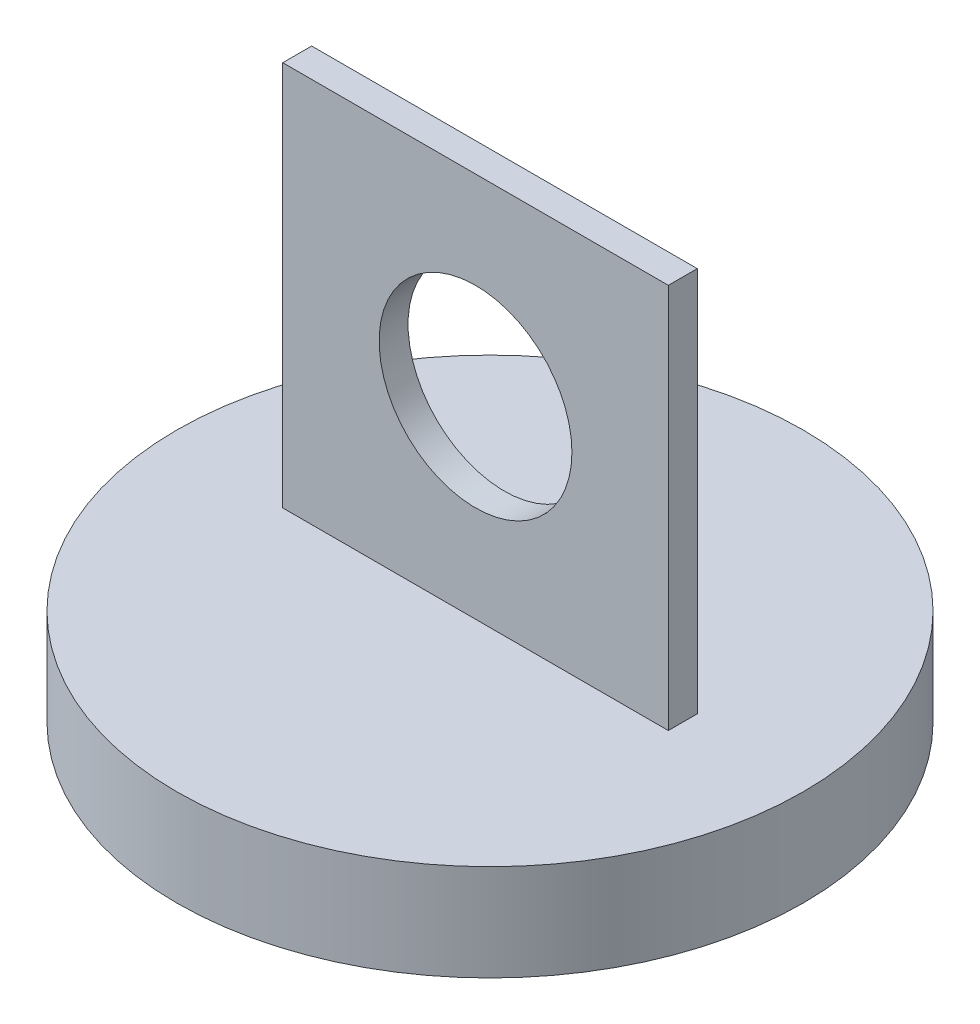
ISO-10303-21;
HEADER;
FILE_DESCRIPTION(('STEP AP214'),'2;1');
FILE_NAME('part.step','',(''),(''),'','','');
FILE_SCHEMA(('AUTOMOTIVE_DESIGN { 1 0 10303 214 1 1 1 1 }'));
ENDSEC;
DATA;
#1=APPLICATION_CONTEXT('core data for automotive mechanical design processes');
#2=APPLICATION_PROTOCOL_DEFINITION('international standard','automotive_design',2000,#1);
#3=PRODUCT_CONTEXT('',#1,'mechanical');
#4=PRODUCT('Part','Part','',(#3));
#5=PRODUCT_RELATED_PRODUCT_CATEGORY('part','',(#4));
#6=PRODUCT_DEFINITION_FORMATION('','',#4);
#7=PRODUCT_DEFINITION_CONTEXT('part definition',#1,'design');
#8=PRODUCT_DEFINITION('design','',#6,#7);
#9=PRODUCT_DEFINITION_SHAPE('','',#8);
#10=(LENGTH_UNIT() NAMED_UNIT(*) SI_UNIT(.MILLI.,.METRE.));
#11=(NAMED_UNIT(*) PLANE_ANGLE_UNIT() SI_UNIT($,.RADIAN.));
#12=(NAMED_UNIT(*) SI_UNIT($,.STERADIAN.) SOLID_ANGLE_UNIT());
#13=UNCERTAINTY_MEASURE_WITH_UNIT(LENGTH_MEASURE(1.E-05),#10,'distance_accuracy_value','');
#14=(GEOMETRIC_REPRESENTATION_CONTEXT(3) GLOBAL_UNCERTAINTY_ASSIGNED_CONTEXT((#13)) GLOBAL_UNIT_ASSIGNED_CONTEXT((#10,
#11,#12)) REPRESENTATION_CONTEXT('',''));
#15=CARTESIAN_POINT('',(0.,0.,0.));
#16=DIRECTION('',(0.,0.,1.));
#17=DIRECTION('',(1.,0.,0.));
#18=AXIS2_PLACEMENT_3D('',#15,#16,#17);
#19=CARTESIAN_POINT('',(0.,10.,0.));
#20=DIRECTION('',(0.,1.,0.));
#21=DIRECTION('',(0.,0.,1.));
#22=AXIS2_PLACEMENT_3D('',#19,#20,#21);
#23=PLANE('',#22);
#24=CARTESIAN_POINT('',(0.,10.,0.));
#25=DIRECTION('',(0.,1.,0.));
#26=DIRECTION('',(0.,0.,1.));
#27=AXIS2_PLACEMENT_3D('',#24,#25,#26);
#28=CIRCLE('',#27,32.5);
#29=CARTESIAN_POINT('',(0.,10.,32.5));
#30=VERTEX_POINT('',#29);
#31=EDGE_CURVE('E11',#30,#30,#28,.T.);
#32=ORIENTED_EDGE('',*,*,#31,.T.);
#33=EDGE_LOOP('',(#32));
#34=FACE_BOUND('',#33,.T.);
#35=DIRECTION('',(1.,0.,0.));
#36=VECTOR('',#35,1.);
#37=CARTESIAN_POINT('',(20.,10.,1.5));
#38=LINE('',#37,#36);
#39=CARTESIAN_POINT('',(-20.,10.,1.5));
#40=VERTEX_POINT('',#39);
#41=CARTESIAN_POINT('',(20.,10.,1.5));
#42=VERTEX_POINT('',#41);
#43=EDGE_CURVE('E94',#40,#42,#38,.T.);
#44=ORIENTED_EDGE('',*,*,#43,.F.);
#45=DIRECTION('',(0.,0.,1.));
#46=VECTOR('',#45,1.);
#47=CARTESIAN_POINT('',(-20.,10.,-1.5));
#48=LINE('',#47,#46);
#49=CARTESIAN_POINT('',(-20.,10.,-1.5));
#50=VERTEX_POINT('',#49);
#51=EDGE_CURVE('E105',#50,#40,#48,.T.);
#52=ORIENTED_EDGE('',*,*,#51,.F.);
#53=DIRECTION('',(-1.,0.,0.));
#54=VECTOR('',#53,1.);
#55=CARTESIAN_POINT('',(20.,10.,-1.5));
#56=LINE('',#55,#54);
#57=CARTESIAN_POINT('',(20.,10.,-1.5));
#58=VERTEX_POINT('',#57);
#59=EDGE_CURVE('E75',#58,#50,#56,.T.);
#60=ORIENTED_EDGE('',*,*,#59,.F.);
#61=DIRECTION('',(0.,0.,-1.));
#62=VECTOR('',#61,1.);
#63=CARTESIAN_POINT('',(20.,10.,-1.5));
#64=LINE('',#63,#62);
#65=EDGE_CURVE('E109',#42,#58,#64,.T.);
#66=ORIENTED_EDGE('',*,*,#65,.F.);
#67=EDGE_LOOP('',(#44,#52,#60,#66));
#68=FACE_BOUND('',#67,.T.);
#69=ADVANCED_FACE('F36',(#34,#68),#23,.T.);
#70=CARTESIAN_POINT('',(0.,10.,0.));
#71=DIRECTION('',(0.,-1.,0.));
#72=DIRECTION('',(0.,0.,-1.));
#73=AXIS2_PLACEMENT_3D('',#70,#71,#72);
#74=CYLINDRICAL_SURFACE('',#73,32.5);
#75=ORIENTED_EDGE('',*,*,#31,.F.);
#76=EDGE_LOOP('',(#75));
#77=FACE_BOUND('',#76,.T.);
#78=CARTESIAN_POINT('',(0.,0.,0.));
#79=DIRECTION('',(0.,1.,0.));
#80=DIRECTION('',(0.,0.,1.));
#81=AXIS2_PLACEMENT_3D('',#78,#79,#80);
#82=CIRCLE('',#81,32.5);
#83=CARTESIAN_POINT('',(0.,0.,32.5));
#84=VERTEX_POINT('',#83);
#85=EDGE_CURVE('E45',#84,#84,#82,.T.);
#86=ORIENTED_EDGE('',*,*,#85,.T.);
#87=EDGE_LOOP('',(#86));
#88=FACE_BOUND('',#87,.T.);
#89=ADVANCED_FACE('F38',(#77,#88),#74,.T.);
#90=CARTESIAN_POINT('',(0.,0.,0.));
#91=DIRECTION('',(0.,1.,0.));
#92=DIRECTION('',(0.,0.,1.));
#93=AXIS2_PLACEMENT_3D('',#90,#91,#92);
#94=PLANE('',#93);
#95=ORIENTED_EDGE('',*,*,#85,.F.);
#96=EDGE_LOOP('',(#95));
#97=FACE_BOUND('',#96,.T.);
#98=ADVANCED_FACE('F118',(#97),#94,.F.);
#99=CARTESIAN_POINT('',(-20.,50.,-1.5));
#100=DIRECTION('',(1.,0.,0.));
#101=DIRECTION('',(0.,0.,-1.));
#102=AXIS2_PLACEMENT_3D('',#99,#100,#101);
#103=PLANE('',#102);
#104=ORIENTED_EDGE('',*,*,#51,.T.);
#105=DIRECTION('',(0.,-1.,0.));
#106=VECTOR('',#105,1.);
#107=CARTESIAN_POINT('',(-20.,50.,1.5));
#108=LINE('',#107,#106);
#109=CARTESIAN_POINT('',(-20.,50.,1.5));
#110=VERTEX_POINT('',#109);
#111=EDGE_CURVE('E97',#110,#40,#108,.T.);
#112=ORIENTED_EDGE('',*,*,#111,.F.);
#113=DIRECTION('',(0.,0.,1.));
#114=VECTOR('',#113,1.);
#115=CARTESIAN_POINT('',(-20.,50.,-1.5));
#116=LINE('',#115,#114);
#117=CARTESIAN_POINT('',(-20.,50.,-1.5));
#118=VERTEX_POINT('',#117);
#119=EDGE_CURVE('E87',#118,#110,#116,.T.);
#120=ORIENTED_EDGE('',*,*,#119,.F.);
#121=DIRECTION('',(0.,-1.,0.));
#122=VECTOR('',#121,1.);
#123=CARTESIAN_POINT('',(-20.,50.,-1.5));
#124=LINE('',#123,#122);
#125=EDGE_CURVE('E101',#118,#50,#124,.T.);
#126=ORIENTED_EDGE('',*,*,#125,.T.);
#127=EDGE_LOOP('',(#104,#112,#120,#126));
#128=FACE_BOUND('',#127,.T.);
#129=ADVANCED_FACE('F120',(#128),#103,.F.);
#130=CARTESIAN_POINT('',(20.,50.,1.5));
#131=DIRECTION('',(0.,0.,-1.));
#132=DIRECTION('',(-1.,0.,0.));
#133=AXIS2_PLACEMENT_3D('',#130,#131,#132);
#134=PLANE('',#133);
#135=CARTESIAN_POINT('',(0.,30.,1.5));
#136=DIRECTION('',(0.,0.,1.));
#137=DIRECTION('',(1.,0.,0.));
#138=AXIS2_PLACEMENT_3D('',#135,#136,#137);
#139=CIRCLE('',#138,10.);
#140=CARTESIAN_POINT('',(10.,30.,1.5));
#141=VERTEX_POINT('',#140);
#142=EDGE_CURVE('E154',#141,#141,#139,.T.);
#143=ORIENTED_EDGE('',*,*,#142,.F.);
#144=EDGE_LOOP('',(#143));
#145=FACE_BOUND('',#144,.T.);
#146=ORIENTED_EDGE('',*,*,#43,.T.);
#147=DIRECTION('',(0.,-1.,0.));
#148=VECTOR('',#147,1.);
#149=CARTESIAN_POINT('',(20.,50.,1.5));
#150=LINE('',#149,#148);
#151=CARTESIAN_POINT('',(20.,50.,1.5));
#152=VERTEX_POINT('',#151);
#153=EDGE_CURVE('E91',#152,#42,#150,.T.);
#154=ORIENTED_EDGE('',*,*,#153,.F.);
#155=DIRECTION('',(1.,0.,0.));
#156=VECTOR('',#155,1.);
#157=CARTESIAN_POINT('',(20.,50.,1.5));
#158=LINE('',#157,#156);
#159=EDGE_CURVE('E82',#110,#152,#158,.T.);
#160=ORIENTED_EDGE('',*,*,#159,.F.);
#161=ORIENTED_EDGE('',*,*,#111,.T.);
#162=EDGE_LOOP('',(#146,#154,#160,#161));
#163=FACE_BOUND('',#162,.T.);
#164=ADVANCED_FACE('F92',(#145,#163),#134,.F.);
#165=CARTESIAN_POINT('',(20.,50.,-1.5));
#166=DIRECTION('',(-1.,0.,0.));
#167=DIRECTION('',(0.,0.,1.));
#168=AXIS2_PLACEMENT_3D('',#165,#166,#167);
#169=PLANE('',#168);
#170=ORIENTED_EDGE('',*,*,#65,.T.);
#171=DIRECTION('',(0.,-1.,0.));
#172=VECTOR('',#171,1.);
#173=CARTESIAN_POINT('',(20.,50.,-1.5));
#174=LINE('',#173,#172);
#175=CARTESIAN_POINT('',(20.,50.,-1.5));
#176=VERTEX_POINT('',#175);
#177=EDGE_CURVE('E53',#176,#58,#174,.T.);
#178=ORIENTED_EDGE('',*,*,#177,.F.);
#179=DIRECTION('',(0.,0.,-1.));
#180=VECTOR('',#179,1.);
#181=CARTESIAN_POINT('',(20.,50.,-1.5));
#182=LINE('',#181,#180);
#183=EDGE_CURVE('E85',#152,#176,#182,.T.);
#184=ORIENTED_EDGE('',*,*,#183,.F.);
#185=ORIENTED_EDGE('',*,*,#153,.T.);
#186=EDGE_LOOP('',(#170,#178,#184,#185));
#187=FACE_BOUND('',#186,.T.);
#188=ADVANCED_FACE('F99',(#187),#169,.F.);
#189=CARTESIAN_POINT('',(20.,50.,-1.5));
#190=DIRECTION('',(0.,0.,1.));
#191=DIRECTION('',(1.,0.,0.));
#192=AXIS2_PLACEMENT_3D('',#189,#190,#191);
#193=PLANE('',#192);
#194=CARTESIAN_POINT('',(0.,30.,-1.5));
#195=DIRECTION('',(0.,0.,1.));
#196=DIRECTION('',(1.,0.,0.));
#197=AXIS2_PLACEMENT_3D('',#194,#195,#196);
#198=CIRCLE('',#197,10.);
#199=CARTESIAN_POINT('',(10.,30.,-1.5));
#200=VERTEX_POINT('',#199);
#201=EDGE_CURVE('E40',#200,#200,#198,.T.);
#202=ORIENTED_EDGE('',*,*,#201,.T.);
#203=EDGE_LOOP('',(#202));
#204=FACE_BOUND('',#203,.T.);
#205=ORIENTED_EDGE('',*,*,#59,.T.);
#206=ORIENTED_EDGE('',*,*,#125,.F.);
#207=DIRECTION('',(-1.,0.,0.));
#208=VECTOR('',#207,1.);
#209=CARTESIAN_POINT('',(20.,50.,-1.5));
#210=LINE('',#209,#208);
#211=EDGE_CURVE('E61',#176,#118,#210,.T.);
#212=ORIENTED_EDGE('',*,*,#211,.F.);
#213=ORIENTED_EDGE('',*,*,#177,.T.);
#214=EDGE_LOOP('',(#205,#206,#212,#213));
#215=FACE_BOUND('',#214,.T.);
#216=ADVANCED_FACE('F140',(#204,#215),#193,.F.);
#217=CARTESIAN_POINT('',(0.,50.,0.));
#218=DIRECTION('',(0.,-1.,0.));
#219=DIRECTION('',(0.,0.,-1.));
#220=AXIS2_PLACEMENT_3D('',#217,#218,#219);
#221=PLANE('',#220);
#222=ORIENTED_EDGE('',*,*,#119,.T.);
#223=ORIENTED_EDGE('',*,*,#159,.T.);
#224=ORIENTED_EDGE('',*,*,#183,.T.);
#225=ORIENTED_EDGE('',*,*,#211,.T.);
#226=EDGE_LOOP('',(#222,#223,#224,#225));
#227=FACE_BOUND('',#226,.T.);
#228=ADVANCED_FACE('F83',(#227),#221,.F.);
#229=CARTESIAN_POINT('',(0.,30.,-38.5));
#230=DIRECTION('',(0.,0.,1.));
#231=DIRECTION('',(1.,0.,0.));
#232=AXIS2_PLACEMENT_3D('',#229,#230,#231);
#233=CYLINDRICAL_SURFACE('',#232,10.);
#234=ORIENTED_EDGE('',*,*,#142,.T.);
#235=EDGE_LOOP('',(#234));
#236=FACE_BOUND('',#235,.T.);
#237=ORIENTED_EDGE('',*,*,#201,.F.);
#238=EDGE_LOOP('',(#237));
#239=FACE_BOUND('',#238,.T.);
#240=ADVANCED_FACE('F146',(#236,#239),#233,.F.);
#241=CLOSED_SHELL('',(#69,#89,#98,#129,#164,#188,#216,#228,#240));
#242=MANIFOLD_SOLID_BREP('B2',#241);
#243=ADVANCED_BREP_SHAPE_REPRESENTATION('',(#18,#242),#14);
#244=SHAPE_DEFINITION_REPRESENTATION(#9,#243);
ENDSEC;
END-ISO-10303-21;
